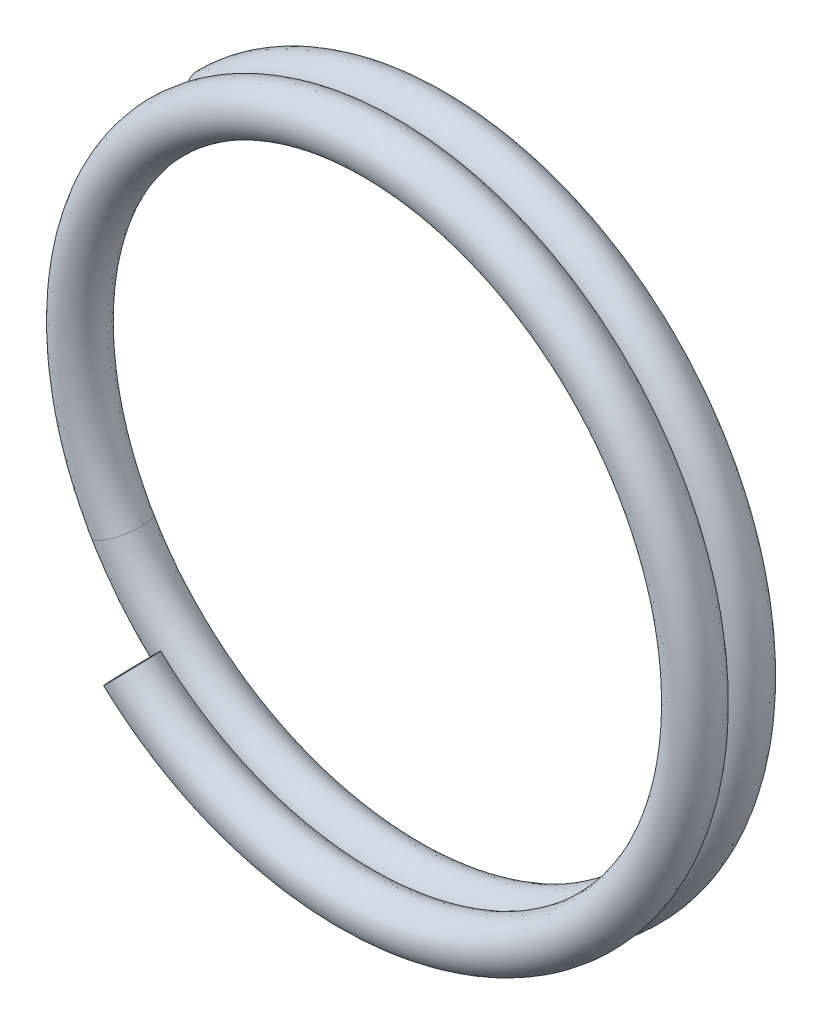
ISO-10303-21;
HEADER;
FILE_DESCRIPTION(('STEP AP214'),'2;1');
FILE_NAME('part.step','',(''),(''),'','','');
FILE_SCHEMA(('AUTOMOTIVE_DESIGN { 1 0 10303 214 1 1 1 1 }'));
ENDSEC;
DATA;
#1=APPLICATION_CONTEXT('core data for automotive mechanical design processes');
#2=APPLICATION_PROTOCOL_DEFINITION('international standard','automotive_design',2000,#1);
#3=PRODUCT_CONTEXT('',#1,'mechanical');
#4=PRODUCT('Part','Part','',(#3));
#5=PRODUCT_RELATED_PRODUCT_CATEGORY('part','',(#4));
#6=PRODUCT_DEFINITION_FORMATION('','',#4);
#7=PRODUCT_DEFINITION_CONTEXT('part definition',#1,'design');
#8=PRODUCT_DEFINITION('design','',#6,#7);
#9=PRODUCT_DEFINITION_SHAPE('','',#8);
#10=(LENGTH_UNIT() NAMED_UNIT(*) SI_UNIT(.MILLI.,.METRE.));
#11=(NAMED_UNIT(*) PLANE_ANGLE_UNIT() SI_UNIT($,.RADIAN.));
#12=(NAMED_UNIT(*) SI_UNIT($,.STERADIAN.) SOLID_ANGLE_UNIT());
#13=UNCERTAINTY_MEASURE_WITH_UNIT(LENGTH_MEASURE(1.E-05),#10,'distance_accuracy_value','');
#14=(GEOMETRIC_REPRESENTATION_CONTEXT(3) GLOBAL_UNCERTAINTY_ASSIGNED_CONTEXT((#13)) GLOBAL_UNIT_ASSIGNED_CONTEXT((#10,
#11,#12)) REPRESENTATION_CONTEXT('',''));
#15=CARTESIAN_POINT('',(0.,0.,0.));
#16=DIRECTION('',(0.,0.,1.));
#17=DIRECTION('',(1.,0.,0.));
#18=AXIS2_PLACEMENT_3D('',#15,#16,#17);
#19=CARTESIAN_POINT('',(-10.2546814627329,10.2546637000319,0.000532693804636463));
#20=CARTESIAN_POINT('',(-9.08014066394839,11.4292065333017,0.0369910271379696));
#21=CARTESIAN_POINT('',(-7.70211579889782,12.3997229269673,0.0734493604712976));
#22=CARTESIAN_POINT('',(-4.69896884327863,13.8201088365864,0.146366027137975));
#23=CARTESIAN_POINT('',(-3.07454058083505,14.2696501941,0.182824360471319));
#24=CARTESIAN_POINT('',(0.231568212953788,14.5952763799785,0.255741027137954));
#25=CARTESIAN_POINT('',(1.91248492479944,14.4712859780187,0.292199360471319));
#26=CARTESIAN_POINT('',(5.13503219646116,13.6640828739622,0.365116027137954));
#27=CARTESIAN_POINT('',(6.67591824222617,12.9810566622429,0.401574360471319));
#28=CARTESIAN_POINT('',(9.43814996525238,11.1353958923143,0.474491027137954));
#29=CARTESIAN_POINT('',(10.6588574764351,9.97318774225218,0.510949360471319));
#30=CARTESIAN_POINT('',(12.637835975716,7.30484895778935,0.583866027137954));
#31=CARTESIAN_POINT('',(13.3956497549094,5.7993347971118,0.620324360471319));
#32=CARTESIAN_POINT('',(14.360008954134,2.62027847420806,0.693241027137954));
#33=CARTESIAN_POINT('',(14.5663315755756,0.947470778198911,0.729699360471319));
#34=CARTESIAN_POINT('',(14.4033264377638,-2.37063366474565,0.802616027137954));
#35=CARTESIAN_POINT('',(14.034036338035,-4.01516382080394,0.839074360471319));
#36=CARTESIAN_POINT('',(12.7627240986044,-7.08439058974954,0.911991027137954));
#37=CARTESIAN_POINT('',(11.8609956736994,-8.50837811064281,0.948449360471319));
#38=CARTESIAN_POINT('',(9.63000782345925,-10.9698981656757,1.02136602713795));
#39=CARTESIAN_POINT('',(8.30126382943871,-12.0068620080042,1.05782436047132));
#40=CARTESIAN_POINT('',(5.37142932907643,-13.5728944373682,1.13074102713795));
#41=CARTESIAN_POINT('',(3.77101571054858,-14.1016012195786,1.16719936047132));
#42=CARTESIAN_POINT('',(0.484866989229607,-14.5890582440379,1.24011602713795));
#43=CARTESIAN_POINT('',(-1.20010890548064,-14.5476958677356,1.27657436047132));
#44=CARTESIAN_POINT('',(-4.45838205685202,-13.8995879752024,1.34949102713795));
#45=CARTESIAN_POINT('',(-6.03092654561308,-13.2929921931277,1.38594936047132));
#46=CARTESIAN_POINT('',(-8.88039332111725,-11.5850908890459,1.45886602713795));
#47=CARTESIAN_POINT('',(-10.1566572876573,-10.4841799482017,1.49532436047132));
#48=CARTESIAN_POINT('',(-11.7885816466357,-8.49567787517372,1.55178610871549));
#49=CARTESIAN_POINT('',(-12.299616940843,-7.73624574752829,1.57178952362637));
#50=CARTESIAN_POINT('',(-12.7355656070563,-6.93592366231378,1.59179293853724));
#51=CARTESIAN_POINT('',(-10.2880172463169,10.2213279164479,1.99997697936642));
#52=CARTESIAN_POINT('',(-9.11729463592023,11.3996889381084,2.03643531269975));
#53=CARTESIAN_POINT('',(-7.74242471164834,12.3746850034852,2.07289364603317));
#54=CARTESIAN_POINT('',(-4.74389512340036,13.8048335161736,2.14581031269967));
#55=CARTESIAN_POINT('',(-3.12092822078001,14.2596555495496,2.18226864603301));
#56=CARTESIAN_POINT('',(0.184122040079644,14.596029200622,2.25518531269983));
#57=CARTESIAN_POINT('',(1.86544182337438,14.4775031049778,2.29164364603301));
#58=CARTESIAN_POINT('',(5.09061315161182,13.680775821996,2.36456031269983));
#59=CARTESIAN_POINT('',(6.633719576262,13.0027587047775,2.40101864603319));
#60=CARTESIAN_POINT('',(9.40195116200854,11.1660773639715,2.47393531269965));
#61=CARTESIAN_POINT('',(10.6264367708654,10.0078374739916,2.5103936460331));
#62=CARTESIAN_POINT('',(12.6140894838437,7.34593192485838,2.58331031269974));
#63=CARTESIAN_POINT('',(13.3767973750363,5.8428812531386,2.61976864603301));
#64=CARTESIAN_POINT('',(14.3514910203962,2.66695985019633,2.69268531269983));
#65=CARTESIAN_POINT('',(14.563251588378,0.994822860922124,2.7291436460331));
#66=CARTESIAN_POINT('',(14.4110329097183,-2.32381148678108,2.80206031269974));
#67=CARTESIAN_POINT('',(14.0470888305761,-3.96954213190655,2.83851864603319));
#68=CARTESIAN_POINT('',(12.7857539982053,-7.04290167817483,2.91143531269965));
#69=CARTESIAN_POINT('',(11.8886546546699,-8.46982053251629,2.94789364603319));
#70=CARTESIAN_POINT('',(9.66566868208958,-10.938593066712,3.02081031269965));
#71=CARTESIAN_POINT('',(8.34029563566314,-11.9798763791956,3.05726864603319));
#72=CARTESIAN_POINT('',(5.41555196907906,-13.5554330886647,3.13018531269965));
#73=CARTESIAN_POINT('',(3.8168570605856,-14.0893424804047,3.1666436460332));
#74=CARTESIAN_POINT('',(0.532292950269066,-14.5874820845183,3.23956031269965));
#75=CARTESIAN_POINT('',(-1.15281740957154,-14.5515972103135,3.27601864603301));
#76=CARTESIAN_POINT('',(-4.41319743254891,-13.914081276622,3.34893531269983));
#77=CARTESIAN_POINT('',(-5.98771384103348,-13.3125975042019,3.38539364603301));
#78=CARTESIAN_POINT('',(-8.84273265245941,-11.6139592124393,3.45831031269983));
#79=CARTESIAN_POINT('',(-10.1225754524956,-10.5171971342004,3.49476864603301));
#80=CARTESIAN_POINT('',(-11.760964018042,-8.53400009840375,3.55123039427733));
#81=CARTESIAN_POINT('',(-12.274468067796,-7.77622923687007,3.57123380918817));
#82=CARTESIAN_POINT('',(-12.7130184139955,-6.97732432681837,3.59123722409902));
#83=CARTESIAN_POINT('',(-8.87380368394384,8.80711435407478,1.99997697936642));
#84=CARTESIAN_POINT('',(-7.86506118092664,9.82349526836088,2.03643531269975));
#85=CARTESIAN_POINT('',(-6.68023366187145,10.6646483711598,2.07289364603317));
#86=CARTESIAN_POINT('',(-4.0958657994561,11.8989129760052,2.14581031269967));
#87=CARTESIAN_POINT('',(-2.69692253213191,12.2917393201033,2.18226864603301));
#88=CARTESIAN_POINT('',(0.152184912749805,12.5832065233795,2.25518531269983));
#89=CARTESIAN_POINT('',(1.60169085309832,12.4817800440801,2.29164364603301));
#90=CARTESIAN_POINT('',(4.38244340227484,11.7963738701155,2.36456031269983));
#91=CARTESIAN_POINT('',(5.7130475661158,11.2125525267451,2.40101864603319));
#92=CARTESIAN_POINT('',(8.10034224007634,9.63040509279368,2.47393531269965));
#93=CARTESIAN_POINT('',(9.15648120687433,8.63244453013764,2.5103936460331));
#94=CARTESIAN_POINT('',(10.8712149219122,6.33852765074262,2.58331031269974));
#95=CARTESIAN_POINT('',(11.5294135104645,5.04310130400089,2.61976864603319));
#96=CARTESIAN_POINT('',(12.3711135420392,2.30560109031618,2.69268531269965));
#97=CARTESIAN_POINT('',(12.5544205247651,0.86415967565613,2.7291436460331));
#98=CARTESIAN_POINT('',(12.4246821485105,-1.99687760420541,2.80206031269974));
#99=CARTESIAN_POINT('',(12.1116667633449,-3.41581247602398,2.83851864603301));
#100=CARTESIAN_POINT('',(11.0256579353914,-6.06589760459705,2.91143531269983));
#101=CARTESIAN_POINT('',(10.2529153962361,-7.29643560481902,2.94789364603301));
#102=CARTESIAN_POINT('',(8.33760343910355,-9.42574217502119,3.02081031269983));
#103=CARTESIAN_POINT('',(7.19547652096193,-10.324018805388,3.05726864603301));
#104=CARTESIAN_POINT('',(4.67478413647628,-11.6836056050788,3.13018531269983));
#105=CARTESIAN_POINT('',(3.29680103270756,-12.1446016652851,3.16664364603301));
#106=CARTESIAN_POINT('',(0.465427080325661,-12.5755168597787,3.23956031269983));
#107=CARTESIAN_POINT('',(-0.987309628088013,-12.5453364385308,3.27601864603319));
#108=CARTESIAN_POINT('',(-3.79834392596791,-11.9972009267918,3.34893531269965));
#109=CARTESIAN_POINT('',(-5.15599207436513,-11.4793724735596,3.3853936460332));
#110=CARTESIAN_POINT('',(-7.61804344235486,-10.0162698030805,3.45831031269965));
#111=CARTESIAN_POINT('',(-8.7218778473983,-9.07133361048879,3.4947686460332));
#112=CARTESIAN_POINT('',(-10.1352092882669,-7.36236947457128,3.55123039427723));
#113=CARTESIAN_POINT('',(-10.5782369665896,-6.70933134165656,3.57123380918813));
#114=CARTESIAN_POINT('',(-10.9566660820903,-6.02079825207511,3.59123722409903));
#115=CARTESIAN_POINT('',(-8.8404679003598,8.84045013765882,0.000532693804636585));
#116=CARTESIAN_POINT('',(-7.82790720895189,9.85301286355785,0.0369910271379698));
#117=CARTESIAN_POINT('',(-6.63992474912129,10.6896862946404,0.0734493604712977));
#118=CARTESIAN_POINT('',(-4.05093951933401,11.9141882964194,0.146366027137975));
#119=CARTESIAN_POINT('',(-2.65053489218695,12.3017339646551,0.182824360471319));
#120=CARTESIAN_POINT('',(0.199631085623949,12.5824537027346,0.255741027137954));
#121=CARTESIAN_POINT('',(1.64873395452375,12.4755629171202,0.292199360471319));
#122=CARTESIAN_POINT('',(4.42686244712381,11.7796809220825,0.365116027137954));
#123=CARTESIAN_POINT('',(5.7552462320807,11.1908504842119,0.401574360471319));
#124=CARTESIAN_POINT('',(8.13654104331945,9.59972362113508,0.474491027137954));
#125=CARTESIAN_POINT('',(9.18890191244476,8.59779479839784,0.510949360471319));
#126=CARTESIAN_POINT('',(10.8949614137837,6.29744468367395,0.583866027137954));
#127=CARTESIAN_POINT('',(11.5482658903376,4.99955484797518,0.620324360471319));
#128=CARTESIAN_POINT('',(12.3796314757769,2.25891971432681,0.693241027137954));
#129=CARTESIAN_POINT('',(12.557500511962,0.816807592932917,0.729699360471319));
#130=CARTESIAN_POINT('',(12.4169756765567,-2.04369978216998,0.802616027137954));
#131=CARTESIAN_POINT('',(12.0986142708045,-3.46143416492136,0.839074360471319));
#132=CARTESIAN_POINT('',(11.0026280357897,-6.10738651617176,0.911991027137954));
#133=CARTESIAN_POINT('',(10.2252564152656,-7.33499318294626,0.948449360471319));
#134=CARTESIAN_POINT('',(8.30194258047322,-9.45704727398422,1.02136602713795));
#135=CARTESIAN_POINT('',(7.15644471473714,-10.3510044341973,1.05782436047132));
#136=CARTESIAN_POINT('',(4.63066149647402,-11.7010669537817,1.13074102713795));
#137=CARTESIAN_POINT('',(3.25095968267054,-12.156860404459,1.16719936047132));
#138=CARTESIAN_POINT('',(0.418001119286201,-12.5770930192984,1.24011602713795));
#139=CARTESIAN_POINT('',(-1.03460112399856,-12.5414350959536,1.27657436047132));
#140=CARTESIAN_POINT('',(-3.84352855026957,-11.9827076253714,1.34949102713795));
#141=CARTESIAN_POINT('',(-5.19920477894438,-11.4597671624861,1.38594936047132));
#142=CARTESIAN_POINT('',(-7.65570411101305,-9.98740147968642,1.45886602713795));
#143=CARTESIAN_POINT('',(-8.75595968256075,-9.03831642449006,1.49532436047132));
#144=CARTESIAN_POINT('',(-10.1628269168601,-7.32404725134125,1.55178610871549));
#145=CARTESIAN_POINT('',(-10.603385839637,-6.66934785231468,1.57178952362637));
#146=CARTESIAN_POINT('',(-10.9792132751518,-5.97939758757038,1.59179293853724));
#147=CARTESIAN_POINT('',(-8.80713211677575,8.87378592124286,-1.99891159175715));
#148=CARTESIAN_POINT('',(-7.79075323697714,9.88253045875482,-1.96245325842381));
#149=CARTESIAN_POINT('',(-6.59961583637113,10.7147242181211,-1.92599492509058));
#150=CARTESIAN_POINT('',(-4.00601323921191,11.9294636168337,-1.85307825842372));
#151=CARTESIAN_POINT('',(-2.60414725224199,12.311728609207,-1.81661992509037));
#152=CARTESIAN_POINT('',(0.247077258498094,12.5817008820896,-1.74370325842392));
#153=CARTESIAN_POINT('',(1.69577705594918,12.4693457901604,-1.70724492509037));
#154=CARTESIAN_POINT('',(4.47128149197279,11.7629879740495,-1.63432825842392));
#155=CARTESIAN_POINT('',(5.7974448980456,11.1691484416788,-1.59786992509056));
#156=CARTESIAN_POINT('',(8.17273984656257,9.56904214947649,-1.52495325842374));
#157=CARTESIAN_POINT('',(9.22132261801521,8.56314506665804,-1.48849492509046));
#158=CARTESIAN_POINT('',(10.9187079056552,6.25636171660528,-1.41557825842383));
#159=CARTESIAN_POINT('',(11.5671182702107,4.95600839194947,-1.37911992509056));
#160=CARTESIAN_POINT('',(12.3881494095147,2.21223833833745,-1.30620325842374));
#161=CARTESIAN_POINT('',(12.5605804991588,0.769455510209702,-1.26974492509047));
#162=CARTESIAN_POINT('',(12.4092692046029,-2.09052196013456,-1.19682825842383));
#163=CARTESIAN_POINT('',(12.0855617782641,-3.50705585381874,-1.16036992509037));
#164=CARTESIAN_POINT('',(10.9795981361881,-6.14887542774647,-1.08745325842392));
#165=CARTESIAN_POINT('',(10.1975974342951,-7.3735507610735,-1.05099492509037));
#166=CARTESIAN_POINT('',(8.26628172184289,-9.48835237294724,-0.978078258423921));
#167=CARTESIAN_POINT('',(7.11741290851234,-10.3779900630067,-0.941619925090374));
#168=CARTESIAN_POINT('',(4.58653885647175,-11.7185283024845,-0.868703258423921));
#169=CARTESIAN_POINT('',(3.20511833263353,-12.169119143633,-0.832244925090375));
#170=CARTESIAN_POINT('',(0.370575158246744,-12.578669178818,-0.759328258423922));
#171=CARTESIAN_POINT('',(-1.08189261990911,-12.5375337533764,-0.722869925090556));
#172=CARTESIAN_POINT('',(-3.88871317457123,-11.9682143239511,-0.649953258423739));
#173=CARTESIAN_POINT('',(-5.24241748352362,-11.4401618514126,-0.613494925090556));
#174=CARTESIAN_POINT('',(-7.69336477967125,-9.95853315629236,-0.54057825842374));
#175=CARTESIAN_POINT('',(-8.79004151772321,-9.00529923849133,-0.504119925090556));
#176=CARTESIAN_POINT('',(-10.1904445454534,-7.28572502811122,-0.44765817684624));
#177=CARTESIAN_POINT('',(-10.6285347126844,-6.62936436297279,-0.4276547619354));
#178=CARTESIAN_POINT('',(-11.0017604682132,-5.93799692306563,-0.407651347024553));
#179=CARTESIAN_POINT('',(-10.2213456791489,10.287999483616,-1.99891159175715));
#180=CARTESIAN_POINT('',(-9.04298669197654,11.4587241284951,-1.96245325842382));
#181=CARTESIAN_POINT('',(-7.66180688614729,12.4247608504494,-1.92599492509058));
#182=CARTESIAN_POINT('',(-4.6540425631569,13.8353841569991,-1.85307825842372));
#183=CARTESIAN_POINT('',(-3.02815294089008,14.2796448386504,-1.81661992509037));
#184=CARTESIAN_POINT('',(0.279014385827932,14.594523559335,-1.74370325842392));
#185=CARTESIAN_POINT('',(1.95952802622451,14.4650688510596,-1.70724492509037));
#186=CARTESIAN_POINT('',(5.17945124131049,13.6473899259285,-1.63432825842392));
#187=CARTESIAN_POINT('',(6.71811690819035,12.9593546197083,-1.59786992509056));
#188=CARTESIAN_POINT('',(9.47434876849623,11.1047144206572,-1.52495325842374));
#189=CARTESIAN_POINT('',(10.6912781820048,9.93853801051275,-1.48849492509047));
#190=CARTESIAN_POINT('',(12.6615824675882,7.26376599072031,-1.41557825842383));
#191=CARTESIAN_POINT('',(13.4145021347825,5.75578834108499,-1.37911992509037));
#192=CARTESIAN_POINT('',(14.3685268878717,2.57359709821978,-1.30620325842392));
#193=CARTESIAN_POINT('',(14.5694115627731,0.900118695475697,-1.26974492509047));
#194=CARTESIAN_POINT('',(14.3956199658092,-2.41745584271022,-1.19682825842383));
#195=CARTESIAN_POINT('',(14.0209838454939,-4.06078550970132,-1.16036992509056));
#196=CARTESIAN_POINT('',(12.7396941990035,-7.12587950132424,-1.08745325842374));
#197=CARTESIAN_POINT('',(11.8333366927289,-8.54693568876932,-1.05099492509056));
#198=CARTESIAN_POINT('',(9.59434696482892,-11.0012032646395,-0.97807825842374));
#199=CARTESIAN_POINT('',(8.26223202321428,-12.0338476368129,-0.941619925090557));
#200=CARTESIAN_POINT('',(5.3273066890738,-13.5903557860718,-0.86870325842374));
#201=CARTESIAN_POINT('',(3.72517436051156,-14.1138599587526,-0.832244925090557));
#202=CARTESIAN_POINT('',(0.437441028190147,-14.5906344035575,-0.75932825842374));
#203=CARTESIAN_POINT('',(-1.24740040138973,-14.5437945251577,-0.722869925090375));
#204=CARTESIAN_POINT('',(-4.50356668115514,-13.8850946737828,-0.649953258423922));
#205=CARTESIAN_POINT('',(-6.07413925019269,-13.2733868820534,-0.613494925090375));
#206=CARTESIAN_POINT('',(-8.91805398977508,-11.5562225656526,-0.540578258423922));
#207=CARTESIAN_POINT('',(-10.1907391228191,-10.451162762203,-0.504119925090375));
#208=CARTESIAN_POINT('',(-11.8161992752293,-8.45735565194369,-0.44765817684634));
#209=CARTESIAN_POINT('',(-12.3247658138901,-7.69626225818651,-0.427654761935436));
#210=CARTESIAN_POINT('',(-12.7581128001171,-6.89452299780918,-0.40765134702454));
#211=CARTESIAN_POINT('',(-10.2546814627329,10.2546637000319,0.000532693804636463));
#212=CARTESIAN_POINT('',(-9.08014066394839,11.4292065333017,0.0369910271379696));
#213=CARTESIAN_POINT('',(-7.70211579889782,12.3997229269673,0.0734493604712976));
#214=CARTESIAN_POINT('',(-4.69896884327863,13.8201088365864,0.146366027137975));
#215=CARTESIAN_POINT('',(-3.07454058083505,14.2696501941,0.182824360471319));
#216=CARTESIAN_POINT('',(0.231568212953788,14.5952763799785,0.255741027137954));
#217=CARTESIAN_POINT('',(1.91248492479944,14.4712859780187,0.292199360471319));
#218=CARTESIAN_POINT('',(5.13503219646116,13.6640828739622,0.365116027137954));
#219=CARTESIAN_POINT('',(6.67591824222617,12.9810566622429,0.401574360471319));
#220=CARTESIAN_POINT('',(9.43814996525238,11.1353958923143,0.474491027137954));
#221=CARTESIAN_POINT('',(10.6588574764351,9.97318774225218,0.510949360471319));
#222=CARTESIAN_POINT('',(12.637835975716,7.30484895778935,0.583866027137954));
#223=CARTESIAN_POINT('',(13.3956497549094,5.7993347971118,0.620324360471319));
#224=CARTESIAN_POINT('',(14.360008954134,2.62027847420806,0.693241027137954));
#225=CARTESIAN_POINT('',(14.5663315755756,0.947470778198911,0.729699360471319));
#226=CARTESIAN_POINT('',(14.4033264377638,-2.37063366474565,0.802616027137954));
#227=CARTESIAN_POINT('',(14.034036338035,-4.01516382080394,0.839074360471319));
#228=CARTESIAN_POINT('',(12.7627240986044,-7.08439058974954,0.911991027137954));
#229=CARTESIAN_POINT('',(11.8609956736994,-8.50837811064281,0.948449360471319));
#230=CARTESIAN_POINT('',(9.63000782345925,-10.9698981656757,1.02136602713795));
#231=CARTESIAN_POINT('',(8.30126382943871,-12.0068620080042,1.05782436047132));
#232=CARTESIAN_POINT('',(5.37142932907643,-13.5728944373682,1.13074102713795));
#233=CARTESIAN_POINT('',(3.77101571054858,-14.1016012195786,1.16719936047132));
#234=CARTESIAN_POINT('',(0.484866989229607,-14.5890582440379,1.24011602713795));
#235=CARTESIAN_POINT('',(-1.20010890548064,-14.5476958677356,1.27657436047132));
#236=CARTESIAN_POINT('',(-4.45838205685202,-13.8995879752024,1.34949102713795));
#237=CARTESIAN_POINT('',(-6.03092654561308,-13.2929921931277,1.38594936047132));
#238=CARTESIAN_POINT('',(-8.88039332111725,-11.5850908890459,1.45886602713795));
#239=CARTESIAN_POINT('',(-10.1566572876573,-10.4841799482017,1.49532436047132));
#240=CARTESIAN_POINT('',(-11.7885816466357,-8.49567787517372,1.55178610871549));
#241=CARTESIAN_POINT('',(-12.299616940843,-7.73624574752829,1.57178952362637));
#242=CARTESIAN_POINT('',(-12.7355656070563,-6.93592366231378,1.59179293853724));
#243=(BOUNDED_SURFACE() B_SPLINE_SURFACE(3,3,((#19,#20,#21,#22,#23,#24,#25,#26,#27,#28,#29,#30,
#31,#32,#33,#34,#35,#36,#37,#38,#39,#40,#41,#42,#43,#44,#45,#46,#47,#48,#49,#50),(#51,#52,#53,
#54,#55,#56,#57,#58,#59,#60,#61,#62,#63,#64,#65,#66,#67,#68,#69,#70,#71,#72,#73,#74,#75,#76,#77,
#78,#79,#80,#81,#82),(#83,#84,#85,#86,#87,#88,#89,#90,#91,#92,#93,#94,#95,#96,#97,#98,#99,#100,
#101,#102,#103,#104,#105,#106,#107,#108,#109,#110,#111,#112,#113,#114),(#115,#116,#117,#118,
#119,#120,#121,#122,#123,#124,#125,#126,#127,#128,#129,#130,#131,#132,#133,#134,#135,#136,#137,
#138,#139,#140,#141,#142,#143,#144,#145,#146),(#147,#148,#149,#150,#151,#152,#153,#154,#155,
#156,#157,#158,#159,#160,#161,#162,#163,#164,#165,#166,#167,#168,#169,#170,#171,#172,#173,#174,
#175,#176,#177,#178),(#179,#180,#181,#182,#183,#184,#185,#186,#187,#188,#189,#190,#191,#192,
#193,#194,#195,#196,#197,#198,#199,#200,#201,#202,#203,#204,#205,#206,#207,#208,#209,#210),
(#211,#212,#213,#214,#215,#216,#217,#218,#219,#220,#221,#222,#223,#224,#225,#226,#227,#228,#229,
#230,#231,#232,#233,#234,#235,#236,#237,#238,#239,#240,#241,#242)),.UNSPECIFIED.,.T.,.F.,
.F.) B_SPLINE_SURFACE_WITH_KNOTS((4,3,4),(4,2,2,2,2,2,2,2,2,2,2,2,2,2,2,4),(0.,0.5,1.),(0.,
0.03125,0.0625,0.09375,0.125,0.15625,0.1875,0.21875,0.25,0.28125,0.3125,0.34375,0.375,0.40625,
0.4375,0.454645784209314),
.UNSPECIFIED.) GEOMETRIC_REPRESENTATION_ITEM() RATIONAL_B_SPLINE_SURFACE(((1.,1.,1.,1.,1.,1.,1.,
1.,1.,1.,1.,1.,1.,1.,1.,1.,1.,1.,1.,1.,1.,1.,1.,1.,1.,1.,1.,1.,1.,1.,1.,1.),(0.333333333333333,
0.333333333333333,0.333333333333333,0.333333333333333,0.333333333333333,0.333333333333333,
0.333333333333333,0.333333333333333,0.333333333333333,0.333333333333333,0.333333333333333,
0.333333333333333,0.333333333333333,0.333333333333333,0.333333333333333,0.333333333333333,
0.333333333333333,0.333333333333333,0.333333333333333,0.333333333333333,0.333333333333333,
0.333333333333333,0.333333333333333,0.333333333333333,0.333333333333333,0.333333333333333,
0.333333333333333,0.333333333333333,0.333333333333333,0.333333333333333,0.333333333333333,
0.333333333333333),(0.333333333333333,0.333333333333333,0.333333333333333,0.333333333333333,
0.333333333333333,0.333333333333333,0.333333333333333,0.333333333333333,0.333333333333333,
0.333333333333333,0.333333333333333,0.333333333333333,0.333333333333333,0.333333333333333,
0.333333333333333,0.333333333333333,0.333333333333333,0.333333333333333,0.333333333333333,
0.333333333333333,0.333333333333333,0.333333333333333,0.333333333333333,0.333333333333333,
0.333333333333333,0.333333333333333,0.333333333333333,0.333333333333333,0.333333333333333,
0.333333333333333,0.333333333333333,0.333333333333333),(1.,1.,1.,1.,1.,1.,1.,1.,1.,1.,1.,1.,1.,
1.,1.,1.,1.,1.,1.,1.,1.,1.,1.,1.,1.,1.,1.,1.,1.,1.,1.,1.),(0.333333333333333,0.333333333333333,
0.333333333333333,0.333333333333333,0.333333333333333,0.333333333333333,0.333333333333333,
0.333333333333333,0.333333333333333,0.333333333333333,0.333333333333333,0.333333333333333,
0.333333333333333,0.333333333333333,0.333333333333333,0.333333333333333,0.333333333333333,
0.333333333333333,0.333333333333333,0.333333333333333,0.333333333333333,0.333333333333333,
0.333333333333333,0.333333333333333,0.333333333333333,0.333333333333333,0.333333333333333,
0.333333333333333,0.333333333333333,0.333333333333333,0.333333333333333,0.333333333333333),
(0.333333333333333,0.333333333333333,0.333333333333333,0.333333333333333,0.333333333333333,
0.333333333333333,0.333333333333333,0.333333333333333,0.333333333333333,0.333333333333333,
0.333333333333333,0.333333333333333,0.333333333333333,0.333333333333333,0.333333333333333,
0.333333333333333,0.333333333333333,0.333333333333333,0.333333333333333,0.333333333333333,
0.333333333333333,0.333333333333333,0.333333333333333,0.333333333333333,0.333333333333333,
0.333333333333333,0.333333333333333,0.333333333333333,0.333333333333333,0.333333333333333,
0.333333333333333,0.333333333333333),(1.,1.,1.,1.,1.,1.,1.,1.,1.,1.,1.,1.,1.,1.,1.,1.,1.,1.,1.,
1.,1.,1.,1.,1.,1.,1.,1.,1.,1.,1.,1.,1.))) REPRESENTATION_ITEM('') SURFACE());
#244=CARTESIAN_POINT('',(-9.54757468154635,9.54755691884536,0.000532693804636463));
#245=DIRECTION('',(0.706910306462711,0.706910306462719,0.0235719586284445));
#246=DIRECTION('',(-0.707106781186552,0.707106781186543,0.));
#247=AXIS2_PLACEMENT_3D('',#244,#245,#246);
#248=CIRCLE('',#247,1.);
#249=CARTESIAN_POINT('',(-10.2546814627329,10.2546637000319,0.000532693804636463));
#250=VERTEX_POINT('',#249);
#251=EDGE_CURVE('E49',#250,#250,#248,.T.);
#252=CARTESIAN_POINT('',(-12.7355656070563,-6.93592366231378,1.59179293853724));
#253=CARTESIAN_POINT('',(-12.7130184139955,-6.97732432681837,3.59123722409902));
#254=CARTESIAN_POINT('',(-10.9566660820903,-6.02079825207511,3.59123722409903));
#255=CARTESIAN_POINT('',(-10.9792132751518,-5.97939758757038,1.59179293853724));
#256=CARTESIAN_POINT('',(-11.0017604682132,-5.93799692306563,-0.407651347024553));
#257=CARTESIAN_POINT('',(-12.7581128001171,-6.89452299780918,-0.40765134702454));
#258=CARTESIAN_POINT('',(-12.7355656070563,-6.93592366231378,1.59179293853724));
#259=(BOUNDED_CURVE() B_SPLINE_CURVE(3,(#252,#253,#254,#255,#256,#257,#258),.UNSPECIFIED.,.T.,
.F.) B_SPLINE_CURVE_WITH_KNOTS((4,3,4),(0.,0.5,1.),
.UNSPECIFIED.) CURVE() GEOMETRIC_REPRESENTATION_ITEM() RATIONAL_B_SPLINE_CURVE((1.,
0.333333333333333,0.333333333333333,1.,0.333333333333333,0.333333333333333,1.)) REPRESENTATION_ITEM(''));
#260=CARTESIAN_POINT('',(-12.7355656070563,-6.93592366231378,1.59179293853724));
#261=VERTEX_POINT('',#260);
#262=EDGE_CURVE('E11',#261,#261,#259,.T.);
#263=ORIENTED_EDGE('',*,*,#251,.T.);
#264=EDGE_LOOP('',(#263));
#265=FACE_BOUND('',#264,.T.);
#266=ORIENTED_EDGE('',*,*,#262,.F.);
#267=EDGE_LOOP('',(#266));
#268=FACE_BOUND('',#267,.T.);
#269=ADVANCED_FACE('F33',(#265,#268),#243,.T.);
#270=CARTESIAN_POINT('',(-9.54757468154635,9.54755691884536,0.000532693804636463));
#271=DIRECTION('',(0.706910306462711,0.706910306462719,0.0235719586284445));
#272=DIRECTION('',(-0.707106781186552,0.707106781186543,0.));
#273=AXIS2_PLACEMENT_3D('',#270,#271,#272);
#274=PLANE('',#273);
#275=ORIENTED_EDGE('',*,*,#251,.F.);
#276=EDGE_LOOP('',(#275));
#277=FACE_BOUND('',#276,.T.);
#278=ADVANCED_FACE('F59',(#277),#274,.F.);
#279=CARTESIAN_POINT('',(-9.5475569188456,-9.54757468154612,3.50053269380464));
#280=DIRECTION('',(-0.706910306462702,0.706910306462728,0.0235719586284445));
#281=DIRECTION('',(-0.707106781186561,-0.707106781186534,0.));
#282=AXIS2_PLACEMENT_3D('',#279,#280,#281);
#283=PLANE('',#282);
#284=CARTESIAN_POINT('',(-9.5475569188456,-9.54757468154612,3.50053269380464));
#285=DIRECTION('',(-0.706910306462702,0.706910306462728,0.0235719586284445));
#286=DIRECTION('',(-0.707106781186561,-0.707106781186534,0.));
#287=AXIS2_PLACEMENT_3D('',#284,#285,#286);
#288=CIRCLE('',#287,1.);
#289=CARTESIAN_POINT('',(-10.2546637000322,-10.2546814627327,3.50053269380464));
#290=VERTEX_POINT('',#289);
#291=EDGE_CURVE('E44',#290,#290,#288,.T.);
#292=ORIENTED_EDGE('',*,*,#291,.T.);
#293=EDGE_LOOP('',(#292));
#294=FACE_BOUND('',#293,.T.);
#295=ADVANCED_FACE('F53',(#294),#283,.T.);
#296=CARTESIAN_POINT('',(-12.7355656070563,-6.93592366231378,1.59179293853724));
#297=CARTESIAN_POINT('',(-13.094179362302,-6.27757434133113,1.60824785695971));
#298=CARTESIAN_POINT('',(-13.4019835168211,-5.59155561404659,1.62470277538218));
#299=CARTESIAN_POINT('',(-14.2141407236371,-3.32173447673152,1.67761602713795));
#300=CARTESIAN_POINT('',(-14.5022956036854,-1.66106552205333,1.71407436047114));
#301=CARTESIAN_POINT('',(-14.5022984808876,1.66104040180103,1.78699102713814));
#302=CARTESIAN_POINT('',(-14.2141464773791,3.32170985560546,1.82344936047132));
#303=CARTESIAN_POINT('',(-13.0949654087513,6.44961994142275,1.89636602713795));
#304=CARTESIAN_POINT('',(-12.264194911151,7.91613792366506,1.9328243604715));
#305=CARTESIAN_POINT('',(-10.1566754478863,10.4841623552631,2.00574102713777));
#306=CARTESIAN_POINT('',(-8.88041338829653,11.5850755067927,2.0421993604715));
#307=CARTESIAN_POINT('',(-6.03094957115197,13.2929817465997,2.11511602713777));
#308=CARTESIAN_POINT('',(-4.45840613311149,13.8995802525615,2.15157436047114));
#309=CARTESIAN_POINT('',(-1.20013410436855,14.5476937889403,2.22449102713814));
#310=CARTESIAN_POINT('',(0.484841718691574,14.5890590838835,2.26094936047114));
#311=CARTESIAN_POINT('',(3.77099128435962,14.1016077515461,2.33386602713814));
#312=CARTESIAN_POINT('',(5.37140581868932,13.5729037415065,2.3703243604715));
#313=CARTESIAN_POINT('',(8.30124303165648,12.0068763870759,2.44324102713777));
#314=CARTESIAN_POINT('',(9.62998882185583,10.9699148463467,2.47969936047114));
#315=CARTESIAN_POINT('',(11.8609809358421,8.50839865573026,2.55261602713814));
#316=CARTESIAN_POINT('',(12.7627118273104,7.08441269677792,2.58907436047114));
#317=CARTESIAN_POINT('',(14.0340293831202,4.01518812994946,2.66199102713814));
#318=CARTESIAN_POINT('',(14.4033223314315,2.37065861356758,2.69844936047077));
#319=CARTESIAN_POINT('',(14.5663332167231,-0.947445547033122,2.7713660271385));
#320=CARTESIAN_POINT('',(14.3600134928445,-2.62025360041631,2.80782436047114));
#321=CARTESIAN_POINT('',(13.3956598002475,-5.79931159373818,2.88074102713814));
#322=CARTESIAN_POINT('',(12.6378486288283,-7.30482706707742,2.91719936047186));
#323=CARTESIAN_POINT('',(10.6588747515563,-9.97316927941246,2.99011602713741));
#324=CARTESIAN_POINT('',(9.43816925348935,-11.1353795439455,3.0265743604715));
#325=CARTESIAN_POINT('',(6.67594072744206,-12.9810450984829,3.09949102713777));
#326=CARTESIAN_POINT('',(5.13505586478922,-13.6640739792594,3.13594936047077));
#327=CARTESIAN_POINT('',(1.912509991331,-14.4712826652747,3.2088660271385));
#328=CARTESIAN_POINT('',(0.231593494261745,-14.5952759788449,3.24532436047114));
#329=CARTESIAN_POINT('',(-3.07451586356019,-14.2696555196642,3.31824102713814));
#330=CARTESIAN_POINT('',(-4.6989449046727,-13.8201169759186,3.3546993604715));
#331=CARTESIAN_POINT('',(-7.70209432062551,-12.3997362682187,3.42761602713777));
#332=CARTESIAN_POINT('',(-9.08012086675838,-11.4292222615095,3.46407436047223));
#333=CARTESIAN_POINT('',(-10.2546637000322,-10.2546814627327,3.50053269380464));
#334=CARTESIAN_POINT('',(-12.7130184139955,-6.97732432681837,3.59123722409902));
#335=CARTESIAN_POINT('',(-13.0737723254158,-6.32014078186939,3.60769214252147));
#336=CARTESIAN_POINT('',(-13.3838065833864,-5.63512265921598,3.62414706094392));
#337=CARTESIAN_POINT('',(-14.2033425035678,-3.36794166775945,3.67706031269983));
#338=CARTESIAN_POINT('',(-14.4968958698946,-1.70820943931095,3.71351864603292));
#339=CARTESIAN_POINT('',(-14.5076982146784,1.61389648454487,3.78643531269992));
#340=CARTESIAN_POINT('',(-14.224944697447,3.27550266457717,3.82289364603319));
#341=CARTESIAN_POINT('',(-13.1159318034294,6.40705098144564,3.89581031269965));
#342=CARTESIAN_POINT('',(-12.2899286449809,7.87626962795897,3.93226864603329));
#343=CARTESIAN_POINT('',(-10.1907572830502,10.4511451692651,4.00518531269956));
#344=CARTESIAN_POINT('',(-8.91807405695473,11.5562071834001,4.04164364603329));
#345=CARTESIAN_POINT('',(-6.07416227573121,13.2733764355247,4.11456031269956));
#346=CARTESIAN_POINT('',(-4.50359075741352,13.8850869511412,4.1510186460331));
#347=CARTESIAN_POINT('',(-1.24742560027873,14.5437924463631,4.22393531269974));
#348=CARTESIAN_POINT('',(0.437415757652479,14.5906352434046,4.2603936460331));
#349=CARTESIAN_POINT('',(3.72514993432224,14.1138664907186,4.33331031269974));
#350=CARTESIAN_POINT('',(5.32728317868597,13.5903650902093,4.36976864603328));
#351=CARTESIAN_POINT('',(8.26221122543278,12.0338620158852,4.44268531269956));
#352=CARTESIAN_POINT('',(9.59432796322695,11.0012199453097,4.47914364603219));
#353=CARTESIAN_POINT('',(11.8333219548701,8.5469562338575,4.55206031270065));
#354=CARTESIAN_POINT('',(12.7396819277074,7.12590160835299,4.58851864603274));
#355=CARTESIAN_POINT('',(14.0209768905813,4.06080981884648,4.6614353127001));
#356=CARTESIAN_POINT('',(14.3956158594769,2.41748079153251,4.69789364603201));
#357=CARTESIAN_POINT('',(14.5694132039207,-0.900093464310273,4.77081031270083));
#358=CARTESIAN_POINT('',(14.3685314265823,-2.57357222442804,4.80726864603274));
#359=CARTESIAN_POINT('',(13.4145121801206,-5.75576513771138,4.8801853127001));
#360=CARTESIAN_POINT('',(12.6615951206999,-7.26374410000911,4.91664364603401));
#361=CARTESIAN_POINT('',(10.6912954571268,-9.9385195476723,4.98956031269883));
#362=CARTESIAN_POINT('',(9.47436805673247,-11.1046980722876,5.02601864603328));
#363=CARTESIAN_POINT('',(6.71813939340696,-12.959343055949,5.09893531269956));
#364=CARTESIAN_POINT('',(5.17947490963747,-13.6473810312256,5.13539364603238));
#365=CARTESIAN_POINT('',(1.95955309275715,-14.4650655383156,5.20831031270047));
#366=CARTESIAN_POINT('',(0.279039667136615,-14.5945231582,5.24476864603274));
#367=CARTESIAN_POINT('',(-3.02812822361595,-14.279650164216,5.3176853127001));
#368=CARTESIAN_POINT('',(-4.65401862455061,-13.8353922963321,5.35414364603329));
#369=CARTESIAN_POINT('',(-7.66178540787535,-12.4247741917001,5.42706031269956));
#370=CARTESIAN_POINT('',(-9.04296689478363,-11.4587398567028,5.4635186460331));
#371=CARTESIAN_POINT('',(-10.2213279164481,-10.2880172463167,5.49997697936642));
#372=CARTESIAN_POINT('',(-10.9566660820903,-6.02079825207511,3.59123722409903));
#373=CARTESIAN_POINT('',(-11.2679639405809,-5.45440716981662,3.60769214252152));
#374=CARTESIAN_POINT('',(-11.535549259673,-4.86399736912289,3.624147060944));
#375=CARTESIAN_POINT('',(-12.2430815105592,-2.90984566317737,3.67706031269965));
#376=CARTESIAN_POINT('',(-12.4968958698946,-1.47913497516322,3.71351864603292));
#377=CARTESIAN_POINT('',(-12.5076982146784,1.38482202039712,3.78643531269992));
#378=CARTESIAN_POINT('',(-12.2646837044377,2.81740665999579,3.82289364603301));
#379=CARTESIAN_POINT('',(-11.3100165357066,5.51758757245811,3.89581031269983));
#380=CARTESIAN_POINT('',(-10.5985844366288,6.78456001501677,3.93226864603329));
#381=CARTESIAN_POINT('',(-8.79005967795147,9.00528164555268,4.00518531269956));
#382=CARTESIAN_POINT('',(-7.69338484685092,9.9585177740398,4.04164364603329));
#383=CARTESIAN_POINT('',(-5.24244050906216,11.4401514048839,4.11456031269956));
#384=CARTESIAN_POINT('',(-3.88873725083109,11.9682066013109,4.1510186460331));
#385=CARTESIAN_POINT('',(-1.08191781879668,12.5375316745804,4.22393531269974));
#386=CARTESIAN_POINT('',(0.370549887708686,12.5786700186643,4.2603936460331));
#387=CARTESIAN_POINT('',(3.20509390644455,12.1691256755998,4.33331031269974));
#388=CARTESIAN_POINT('',(4.58651534608281,11.7185376066235,4.36976864603329));
#389=CARTESIAN_POINT('',(7.11739211073191,10.3780044420776,4.44268531269956));
#390=CARTESIAN_POINT('',(8.26626272024163,9.48836905361533,4.47914364603256));
#391=CARTESIAN_POINT('',(10.1975826964355,7.37357130616388,4.55206031270028));
#392=CARTESIAN_POINT('',(10.9795858648913,6.14889753477487,4.5885186460331));
#393=CARTESIAN_POINT('',(12.0855548233522,3.50708016296429,4.66143531269974));
#394=CARTESIAN_POINT('',(12.4092650982699,2.09054690895615,4.69789364603201));
#395=CARTESIAN_POINT('',(12.5605821403071,-0.769430279043527,4.77081031270083));
#396=CARTESIAN_POINT('',(12.3881539482267,-2.21221346454787,4.8072686460331));
#397=CARTESIAN_POINT('',(11.5671283155474,-4.95598518857365,4.88018531269974));
#398=CARTESIAN_POINT('',(10.9187205587712,-6.25633982589551,4.91664364603438));
#399=CARTESIAN_POINT('',(9.22133989313285,-8.56312660381612,4.98956031269847));
#400=CARTESIAN_POINT('',(8.17275913480175,-9.56902580110398,5.02601864603329));
#401=CARTESIAN_POINT('',(5.79746738325933,-11.1691368779224,5.09893531269956));
#402=CARTESIAN_POINT('',(4.47130516030233,-11.7629790793466,5.13539364603201));
#403=CARTESIAN_POINT('',(1.6958021224793,-12.4693424774164,5.20831031270083));
#404=CARTESIAN_POINT('',(0.247102539806076,-12.5817004809568,5.24476864603274));
#405=CARTESIAN_POINT('',(-2.6041225349671,-12.3117339347704,5.3176853127001));
#406=CARTESIAN_POINT('',(-4.00598930060773,-11.9294717561652,5.35414364603329));
#407=CARTESIAN_POINT('',(-6.59959435809704,-10.7147375593732,5.42706031269956));
#408=CARTESIAN_POINT('',(-7.79073343978196,-9.88254618696631,5.46351864603456));
#409=CARTESIAN_POINT('',(-8.807114354075,-8.87380368394363,5.49997697936642));
#410=CARTESIAN_POINT('',(-10.9792132751518,-5.97939758757038,1.59179293853724));
#411=CARTESIAN_POINT('',(-11.288370977468,-5.41184072927818,1.60824785695971));
#412=CARTESIAN_POINT('',(-11.5537261931087,-4.82043032395333,1.62470277538218));
#413=CARTESIAN_POINT('',(-12.2538797306263,-2.8636384721498,1.67761602713795));
#414=CARTESIAN_POINT('',(-12.5022956036854,-1.43199105790669,1.71407436047114));
#415=CARTESIAN_POINT('',(-12.5022984808876,1.43196593765437,1.78699102713814));
#416=CARTESIAN_POINT('',(-12.2538854843698,2.86361385102372,1.82344936047132));
#417=CARTESIAN_POINT('',(-11.2890501410285,5.56015653243559,1.89636602713795));
#418=CARTESIAN_POINT('',(-10.5728507027981,6.82442831072213,1.9328243604715));
#419=CARTESIAN_POINT('',(-8.75597784278828,9.0382988315514,2.00574102713777));
#420=CARTESIAN_POINT('',(-7.65572417819236,9.98738609743313,2.0421993604715));
#421=CARTESIAN_POINT('',(-5.19922780448328,11.4597567159581,2.11511602713777));
#422=CARTESIAN_POINT('',(-3.84355262652907,11.9826999027305,2.15157436047114));
#423=CARTESIAN_POINT('',(-1.0346263228865,12.5414330171583,2.22449102713814));
#424=CARTESIAN_POINT('',(0.417975848748145,12.5770938591439,2.26094936047114));
#425=CARTESIAN_POINT('',(3.25093525648156,12.1568669364265,2.33386602713814));
#426=CARTESIAN_POINT('',(4.63063798608471,11.70107625792,2.3703243604715));
#427=CARTESIAN_POINT('',(7.15642391695707,10.351018813269,2.44324102713777));
#428=CARTESIAN_POINT('',(8.30192357887269,9.4570639546523,2.47969936047114));
#429=CARTESIAN_POINT('',(10.2252416774053,7.33501372803663,2.55261602713814));
#430=CARTESIAN_POINT('',(11.0026157644943,6.10740862320016,2.58907436047114));
#431=CARTESIAN_POINT('',(12.0986073158912,3.46145847406691,2.66199102713814));
#432=CARTESIAN_POINT('',(12.4169715702244,2.04372473099121,2.69844936047077));
#433=CARTESIAN_POINT('',(12.5575021531095,-0.816782361766377,2.7713660271385));
#434=CARTESIAN_POINT('',(12.3796360144889,-2.2588948405365,2.80782436047114));
#435=CARTESIAN_POINT('',(11.5482759356743,-4.99953164460009,2.88074102713814));
#436=CARTESIAN_POINT('',(10.8949740669005,-6.29742279296418,2.91719936047187));
#437=CARTESIAN_POINT('',(9.18891918756168,-8.59777633555592,2.99011602713741));
#438=CARTESIAN_POINT('',(8.1365603315579,-9.59970727276331,3.0265743604715));
#439=CARTESIAN_POINT('',(5.75526871729515,-11.1908389204548,3.09949102713777));
#440=CARTESIAN_POINT('',(4.42688611545263,-11.7796720273797,3.13594936047077));
#441=CARTESIAN_POINT('',(1.6487590210546,-12.4755596043762,3.2088660271385));
#442=CARTESIAN_POINT('',(0.199656366931932,-12.582453301601,3.24532436047114));
#443=CARTESIAN_POINT('',(-2.65051017491206,-12.3017392902193,3.31824102713814));
#444=CARTESIAN_POINT('',(-4.05091558072946,-11.9141964357517,3.3546993604715));
#445=CARTESIAN_POINT('',(-6.63990327084757,-10.6896996358918,3.42761602713777));
#446=CARTESIAN_POINT('',(-7.82788741175744,-9.85302859177006,3.46407436047223));
#447=CARTESIAN_POINT('',(-8.84045013765904,-8.84046790035958,3.50053269380464));
#448=CARTESIAN_POINT('',(-11.0017604682132,-5.93799692306563,-0.407651347024553));
#449=CARTESIAN_POINT('',(-11.3087780143551,-5.36927428873975,-0.391196428602103));
#450=CARTESIAN_POINT('',(-11.5719031265445,-4.77686327878378,-0.374741510179649));
#451=CARTESIAN_POINT('',(-12.2646779506935,-2.81743128112223,-0.32182825842374));
#452=CARTESIAN_POINT('',(-12.5076953374762,-1.38484714065017,-0.285369925090647));
#453=CARTESIAN_POINT('',(-12.4968987470968,1.47910985491162,-0.212453258423649));
#454=CARTESIAN_POINT('',(-12.243087264302,2.90982104205165,-0.175994925090374));
#455=CARTESIAN_POINT('',(-11.2680837463503,5.60272549241306,-0.103078258423921));
#456=CARTESIAN_POINT('',(-10.5471169689674,6.86429660642749,-0.0666199250902834));
#457=CARTESIAN_POINT('',(-8.72189600762509,9.07131601755013,0.00629674157598752));
#458=CARTESIAN_POINT('',(-7.6180635095338,10.0162544208265,0.0427550749097167));
#459=CARTESIAN_POINT('',(-5.1560150999044,11.4793620270323,0.115671741575988));
#460=CARTESIAN_POINT('',(-3.79836800222704,11.9971932041501,0.152130074909171));
#461=CARTESIAN_POINT('',(-0.987334826976315,12.5453343597362,0.225046741576533));
#462=CARTESIAN_POINT('',(0.465401809787604,12.5755176996236,0.261505074909171));
#463=CARTESIAN_POINT('',(3.29677660651858,12.1446081972533,0.334421741576533));
#464=CARTESIAN_POINT('',(4.67476062608661,11.6836149092164,0.370880074909717));
#465=CARTESIAN_POINT('',(7.19545572318223,10.3240331844604,0.443796741575987));
#466=CARTESIAN_POINT('',(8.33758443750375,9.42575885568927,0.480255074909717));
#467=CARTESIAN_POINT('',(10.2529006583751,7.29645614990939,0.553171741575988));
#468=CARTESIAN_POINT('',(11.0256456640974,6.06591971162545,0.589630074909171));
#469=CARTESIAN_POINT('',(12.1116598084301,3.41583678516952,0.662546741576533));
#470=CARTESIAN_POINT('',(12.4246780421789,1.99690255302627,0.699005074909535));
#471=CARTESIAN_POINT('',(12.554422165912,-0.864134444489228,0.77192174157617));
#472=CARTESIAN_POINT('',(12.3711180807512,-2.30557621652514,0.808380074909171));
#473=CARTESIAN_POINT('',(11.5294235558012,-5.04307810062653,0.881296741576533));
#474=CARTESIAN_POINT('',(10.8712275750297,-6.33850576003285,0.917755074909353));
#475=CARTESIAN_POINT('',(9.15649848199051,-8.63242606729571,0.990671741576351));
#476=CARTESIAN_POINT('',(8.10036152831406,-9.63038874442263,1.02713007490972));
#477=CARTESIAN_POINT('',(5.71307005133098,-11.2125409629873,1.10004674157599));
#478=CARTESIAN_POINT('',(4.38246707060293,-11.7963649754127,1.13650507490953));
#479=CARTESIAN_POINT('',(1.6017159196299,-12.4817767313361,1.20942174157617));
#480=CARTESIAN_POINT('',(0.152210194057787,-12.5832061222452,1.24588007490953));
#481=CARTESIAN_POINT('',(-2.69689781485703,-12.2917446456682,1.31879674157617));
#482=CARTESIAN_POINT('',(-4.09584186085118,-11.8989211153382,1.35525507490972));
#483=CARTESIAN_POINT('',(-6.68021218359809,-10.6646617124104,1.42817174157599));
#484=CARTESIAN_POINT('',(-7.86504138373292,-9.82351099657382,1.4646300749099));
#485=CARTESIAN_POINT('',(-8.87378592124308,-8.80713211677554,1.50108840824285));
#486=CARTESIAN_POINT('',(-12.7581128001171,-6.89452299780918,-0.40765134702454));
#487=CARTESIAN_POINT('',(-13.1145863991881,-6.23500790079288,-0.39119642860205));
#488=CARTESIAN_POINT('',(-13.4201604502559,-5.5479885688772,-0.374741510179567));
#489=CARTESIAN_POINT('',(-14.2249389437064,-3.27552728570359,-0.321828258423922));
#490=CARTESIAN_POINT('',(-14.5076953374762,-1.61392160479571,-0.285369925090648));
#491=CARTESIAN_POINT('',(-14.4968987470968,1.70818431905719,-0.212453258423649));
#492=CARTESIAN_POINT('',(-14.2033482573113,3.36791704663376,-0.175994925090557));
#493=CARTESIAN_POINT('',(-13.0739990140731,6.49218890139986,-0.10307825842374));
#494=CARTESIAN_POINT('',(-12.238461177321,7.95600621937114,-0.0666199250902839));
#495=CARTESIAN_POINT('',(-10.1225936127224,10.5171795412611,0.0062967415759871));
#496=CARTESIAN_POINT('',(-8.84275271963833,11.6139438301853,0.0427550749097162));
#497=CARTESIAN_POINT('',(-5.98773686657273,13.3125870576746,0.115671741575987));
#498=CARTESIAN_POINT('',(-4.41322150880946,13.9140735539818,0.152130074909171));
#499=CARTESIAN_POINT('',(-1.15284260845836,14.5515951315174,0.225046741576533));
#500=CARTESIAN_POINT('',(0.532267679730669,14.5874829243624,0.26150507490917));
#501=CARTESIAN_POINT('',(3.816832634397,14.0893490123736,0.334421741576532));
#502=CARTESIAN_POINT('',(5.41552845869268,13.5554423928037,0.370880074909716));
#503=CARTESIAN_POINT('',(8.34027483788019,11.9798907582665,0.443796741575987));
#504=CARTESIAN_POINT('',(9.66564968048471,10.9386097473837,0.48025507491008));
#505=CARTESIAN_POINT('',(11.888639916814,8.46984107760302,0.553171741575623));
#506=CARTESIAN_POINT('',(12.7857417269135,7.04292378520284,0.589630074909534));
#507=CARTESIAN_POINT('',(14.0470818756592,3.96956644105244,0.662546741576169));
#508=CARTESIAN_POINT('',(14.411028803386,2.32383643560264,0.699005074909535));
#509=CARTESIAN_POINT('',(14.5632532295256,-0.994797629755971,0.771921741576169));
#510=CARTESIAN_POINT('',(14.3514955591068,-2.66693497640459,0.808380074909534));
#511=CARTESIAN_POINT('',(13.3768074203744,-5.84285804976498,0.881296741576169));
#512=CARTESIAN_POINT('',(12.6141021369568,-7.34591003414573,0.917755074909716));
#513=CARTESIAN_POINT('',(10.6264540459859,-10.0078190111526,0.990671741575987));
#514=CARTESIAN_POINT('',(9.40197045024624,-11.1660610156033,1.02713007490972));
#515=CARTESIAN_POINT('',(6.63374206147716,-13.0027471410168,1.10004674157599));
#516=CARTESIAN_POINT('',(5.09063681994098,-13.6807669272932,1.13650507490917));
#517=CARTESIAN_POINT('',(1.86546688990484,-14.4774997922338,1.20942174157653));
#518=CARTESIAN_POINT('',(0.184147321386872,-14.5960287994899,1.24588007490953));
#519=CARTESIAN_POINT('',(-3.12090350350442,-14.2596608751123,1.31879674157617));
#520=CARTESIAN_POINT('',(-4.74387118479479,-13.8048416555051,1.35525507490972));
#521=CARTESIAN_POINT('',(-7.74240323337567,-12.3746983447373,1.42817174157599));
#522=CARTESIAN_POINT('',(-9.11727483873313,-11.3997046663162,1.46463007491135));
#523=CARTESIAN_POINT('',(-10.2879994836162,-10.2213456791486,1.50108840824285));
#524=CARTESIAN_POINT('',(-12.7355656070563,-6.93592366231378,1.59179293853724));
#525=CARTESIAN_POINT('',(-13.094179362302,-6.27757434133113,1.60824785695971));
#526=CARTESIAN_POINT('',(-13.4019835168211,-5.59155561404659,1.62470277538218));
#527=CARTESIAN_POINT('',(-14.2141407236371,-3.32173447673152,1.67761602713795));
#528=CARTESIAN_POINT('',(-14.5022956036854,-1.66106552205333,1.71407436047114));
#529=CARTESIAN_POINT('',(-14.5022984808876,1.66104040180103,1.78699102713814));
#530=CARTESIAN_POINT('',(-14.2141464773791,3.32170985560546,1.82344936047132));
#531=CARTESIAN_POINT('',(-13.0949654087513,6.44961994142275,1.89636602713795));
#532=CARTESIAN_POINT('',(-12.264194911151,7.91613792366506,1.9328243604715));
#533=CARTESIAN_POINT('',(-10.1566754478863,10.4841623552631,2.00574102713777));
#534=CARTESIAN_POINT('',(-8.88041338829653,11.5850755067927,2.0421993604715));
#535=CARTESIAN_POINT('',(-6.03094957115197,13.2929817465997,2.11511602713777));
#536=CARTESIAN_POINT('',(-4.45840613311149,13.8995802525615,2.15157436047114));
#537=CARTESIAN_POINT('',(-1.20013410436855,14.5476937889403,2.22449102713814));
#538=CARTESIAN_POINT('',(0.484841718691574,14.5890590838835,2.26094936047114));
#539=CARTESIAN_POINT('',(3.77099128435962,14.1016077515461,2.33386602713814));
#540=CARTESIAN_POINT('',(5.37140581868932,13.5729037415065,2.3703243604715));
#541=CARTESIAN_POINT('',(8.30124303165648,12.0068763870759,2.44324102713777));
#542=CARTESIAN_POINT('',(9.62998882185583,10.9699148463467,2.47969936047114));
#543=CARTESIAN_POINT('',(11.8609809358421,8.50839865573026,2.55261602713814));
#544=CARTESIAN_POINT('',(12.7627118273104,7.08441269677792,2.58907436047114));
#545=CARTESIAN_POINT('',(14.0340293831202,4.01518812994946,2.66199102713814));
#546=CARTESIAN_POINT('',(14.4033223314315,2.37065861356758,2.69844936047077));
#547=CARTESIAN_POINT('',(14.5663332167231,-0.947445547033122,2.7713660271385));
#548=CARTESIAN_POINT('',(14.3600134928445,-2.62025360041631,2.80782436047114));
#549=CARTESIAN_POINT('',(13.3956598002475,-5.79931159373818,2.88074102713814));
#550=CARTESIAN_POINT('',(12.6378486288283,-7.30482706707742,2.91719936047186));
#551=CARTESIAN_POINT('',(10.6588747515563,-9.97316927941246,2.99011602713741));
#552=CARTESIAN_POINT('',(9.43816925348935,-11.1353795439455,3.0265743604715));
#553=CARTESIAN_POINT('',(6.67594072744206,-12.9810450984829,3.09949102713777));
#554=CARTESIAN_POINT('',(5.13505586478922,-13.6640739792594,3.13594936047077));
#555=CARTESIAN_POINT('',(1.912509991331,-14.4712826652747,3.2088660271385));
#556=CARTESIAN_POINT('',(0.231593494261745,-14.5952759788449,3.24532436047114));
#557=CARTESIAN_POINT('',(-3.07451586356019,-14.2696555196642,3.31824102713814));
#558=CARTESIAN_POINT('',(-4.6989449046727,-13.8201169759186,3.3546993604715));
#559=CARTESIAN_POINT('',(-7.70209432062551,-12.3997362682187,3.42761602713777));
#560=CARTESIAN_POINT('',(-9.08012086675838,-11.4292222615095,3.46407436047223));
#561=CARTESIAN_POINT('',(-10.2546637000322,-10.2546814627327,3.50053269380464));
#562=(BOUNDED_SURFACE() B_SPLINE_SURFACE(3,3,((#296,#297,#298,#299,#300,#301,#302,#303,#304,
#305,#306,#307,#308,#309,#310,#311,#312,#313,#314,#315,#316,#317,#318,#319,#320,#321,#322,#323,
#324,#325,#326,#327,#328,#329,#330,#331,#332,#333),(#334,#335,#336,#337,#338,#339,#340,#341,
#342,#343,#344,#345,#346,#347,#348,#349,#350,#351,#352,#353,#354,#355,#356,#357,#358,#359,#360,
#361,#362,#363,#364,#365,#366,#367,#368,#369,#370,#371),(#372,#373,#374,#375,#376,#377,#378,
#379,#380,#381,#382,#383,#384,#385,#386,#387,#388,#389,#390,#391,#392,#393,#394,#395,#396,#397,
#398,#399,#400,#401,#402,#403,#404,#405,#406,#407,#408,#409),(#410,#411,#412,#413,#414,#415,
#416,#417,#418,#419,#420,#421,#422,#423,#424,#425,#426,#427,#428,#429,#430,#431,#432,#433,#434,
#435,#436,#437,#438,#439,#440,#441,#442,#443,#444,#445,#446,#447),(#448,#449,#450,#451,#452,
#453,#454,#455,#456,#457,#458,#459,#460,#461,#462,#463,#464,#465,#466,#467,#468,#469,#470,#471,
#472,#473,#474,#475,#476,#477,#478,#479,#480,#481,#482,#483,#484,#485),(#486,#487,#488,#489,
#490,#491,#492,#493,#494,#495,#496,#497,#498,#499,#500,#501,#502,#503,#504,#505,#506,#507,#508,
#509,#510,#511,#512,#513,#514,#515,#516,#517,#518,#519,#520,#521,#522,#523),(#524,#525,#526,
#527,#528,#529,#530,#531,#532,#533,#534,#535,#536,#537,#538,#539,#540,#541,#542,#543,#544,#545,
#546,#547,#548,#549,#550,#551,#552,#553,#554,#555,#556,#557,#558,#559,#560,#561)),.UNSPECIFIED.,
.T.,.F.,.F.) B_SPLINE_SURFACE_WITH_KNOTS((4,3,4),(4,2,2,2,2,2,2,2,2,2,2,2,2,2,2,2,2,2,4),(0.,
0.5,1.),(0.454645784209314,0.46875,0.5,0.53125,0.5625,0.59375,0.625,0.65625,0.6875,0.71875,0.75,
0.78125,0.8125,0.84375,0.875,0.90625,0.9375,0.96875,1.),
.UNSPECIFIED.) GEOMETRIC_REPRESENTATION_ITEM() RATIONAL_B_SPLINE_SURFACE(((1.,1.,1.,1.,1.,1.,1.,
1.,1.,1.,1.,1.,1.,1.,1.,1.,1.,1.,1.,1.,1.,1.,1.,1.,1.,1.,1.,1.,1.,1.,1.,1.,1.,1.,1.,1.,1.,1.),
(0.333333333333333,0.333333333333333,0.333333333333333,0.333333333333333,0.333333333333333,
0.333333333333333,0.333333333333333,0.333333333333333,0.333333333333333,0.333333333333333,
0.333333333333333,0.333333333333333,0.333333333333333,0.333333333333333,0.333333333333333,
0.333333333333333,0.333333333333333,0.333333333333333,0.333333333333333,0.333333333333333,
0.333333333333333,0.333333333333333,0.333333333333333,0.333333333333333,0.333333333333333,
0.333333333333333,0.333333333333333,0.333333333333333,0.333333333333333,0.333333333333333,
0.333333333333333,0.333333333333333,0.333333333333333,0.333333333333333,0.333333333333333,
0.333333333333333,0.333333333333333,0.333333333333333),(0.333333333333333,0.333333333333333,
0.333333333333333,0.333333333333333,0.333333333333333,0.333333333333333,0.333333333333333,
0.333333333333333,0.333333333333333,0.333333333333333,0.333333333333333,0.333333333333333,
0.333333333333333,0.333333333333333,0.333333333333333,0.333333333333333,0.333333333333333,
0.333333333333333,0.333333333333333,0.333333333333333,0.333333333333333,0.333333333333333,
0.333333333333333,0.333333333333333,0.333333333333333,0.333333333333333,0.333333333333333,
0.333333333333333,0.333333333333333,0.333333333333333,0.333333333333333,0.333333333333333,
0.333333333333333,0.333333333333333,0.333333333333333,0.333333333333333,0.333333333333333,
0.333333333333333),(1.,1.,1.,1.,1.,1.,1.,1.,1.,1.,1.,1.,1.,1.,1.,1.,1.,1.,1.,1.,1.,1.,1.,1.,1.,
1.,1.,1.,1.,1.,1.,1.,1.,1.,1.,1.,1.,1.),(0.333333333333333,0.333333333333333,0.333333333333333,
0.333333333333333,0.333333333333333,0.333333333333333,0.333333333333333,0.333333333333333,
0.333333333333333,0.333333333333333,0.333333333333333,0.333333333333333,0.333333333333333,
0.333333333333333,0.333333333333333,0.333333333333333,0.333333333333333,0.333333333333333,
0.333333333333333,0.333333333333333,0.333333333333333,0.333333333333333,0.333333333333333,
0.333333333333333,0.333333333333333,0.333333333333333,0.333333333333333,0.333333333333333,
0.333333333333333,0.333333333333333,0.333333333333333,0.333333333333333,0.333333333333333,
0.333333333333333,0.333333333333333,0.333333333333333,0.333333333333333,0.333333333333333),
(0.333333333333333,0.333333333333333,0.333333333333333,0.333333333333333,0.333333333333333,
0.333333333333333,0.333333333333333,0.333333333333333,0.333333333333333,0.333333333333333,
0.333333333333333,0.333333333333333,0.333333333333333,0.333333333333333,0.333333333333333,
0.333333333333333,0.333333333333333,0.333333333333333,0.333333333333333,0.333333333333333,
0.333333333333333,0.333333333333333,0.333333333333333,0.333333333333333,0.333333333333333,
0.333333333333333,0.333333333333333,0.333333333333333,0.333333333333333,0.333333333333333,
0.333333333333333,0.333333333333333,0.333333333333333,0.333333333333333,0.333333333333333,
0.333333333333333,0.333333333333333,0.333333333333333),(1.,1.,1.,1.,1.,1.,1.,1.,1.,1.,1.,1.,1.,
1.,1.,1.,1.,1.,1.,1.,1.,1.,1.,1.,1.,1.,1.,1.,1.,1.,1.,1.,1.,1.,1.,1.,1.,1.))) REPRESENTATION_ITEM('') SURFACE());
#563=ORIENTED_EDGE('',*,*,#262,.T.);
#564=EDGE_LOOP('',(#563));
#565=FACE_BOUND('',#564,.T.);
#566=ORIENTED_EDGE('',*,*,#291,.F.);
#567=EDGE_LOOP('',(#566));
#568=FACE_BOUND('',#567,.T.);
#569=ADVANCED_FACE('F60',(#565,#568),#562,.T.);
#570=CLOSED_SHELL('',(#269,#278,#295,#569));
#571=MANIFOLD_SOLID_BREP('B2',#570);
#572=ADVANCED_BREP_SHAPE_REPRESENTATION('',(#18,#571),#14);
#573=SHAPE_DEFINITION_REPRESENTATION(#9,#572);
ENDSEC;
END-ISO-10303-21;
